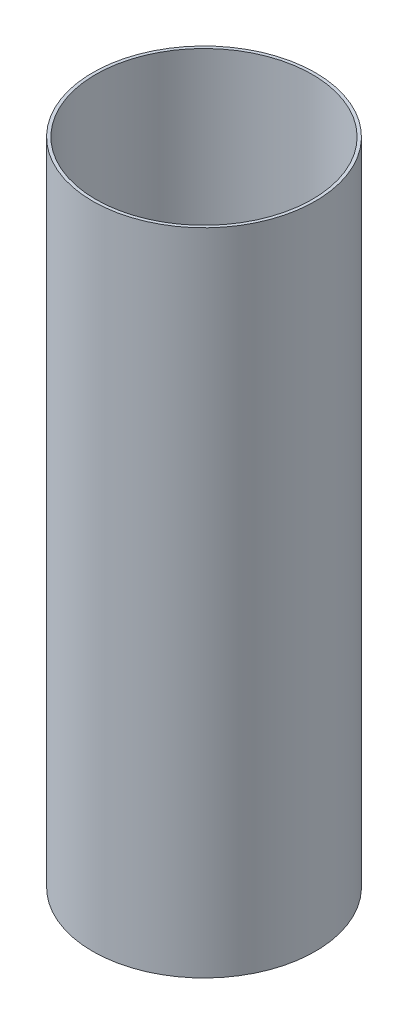
ISO-10303-21;
HEADER;
FILE_DESCRIPTION(('STEP AP214'),'2;1');
FILE_NAME('part.step','',(''),(''),'','','');
FILE_SCHEMA(('AUTOMOTIVE_DESIGN { 1 0 10303 214 1 1 1 1 }'));
ENDSEC;
DATA;
#1=APPLICATION_CONTEXT('core data for automotive mechanical design processes');
#2=APPLICATION_PROTOCOL_DEFINITION('international standard','automotive_design',2000,#1);
#3=PRODUCT_CONTEXT('',#1,'mechanical');
#4=PRODUCT('Part','Part','',(#3));
#5=PRODUCT_RELATED_PRODUCT_CATEGORY('part','',(#4));
#6=PRODUCT_DEFINITION_FORMATION('','',#4);
#7=PRODUCT_DEFINITION_CONTEXT('part definition',#1,'design');
#8=PRODUCT_DEFINITION('design','',#6,#7);
#9=PRODUCT_DEFINITION_SHAPE('','',#8);
#10=(LENGTH_UNIT() NAMED_UNIT(*) SI_UNIT(.MILLI.,.METRE.));
#11=(NAMED_UNIT(*) PLANE_ANGLE_UNIT() SI_UNIT($,.RADIAN.));
#12=(NAMED_UNIT(*) SI_UNIT($,.STERADIAN.) SOLID_ANGLE_UNIT());
#13=UNCERTAINTY_MEASURE_WITH_UNIT(LENGTH_MEASURE(1.E-05),#10,'distance_accuracy_value','');
#14=(GEOMETRIC_REPRESENTATION_CONTEXT(3) GLOBAL_UNCERTAINTY_ASSIGNED_CONTEXT((#13)) GLOBAL_UNIT_ASSIGNED_CONTEXT((#10,
#11,#12)) REPRESENTATION_CONTEXT('',''));
#15=CARTESIAN_POINT('',(0.,0.,0.));
#16=DIRECTION('',(0.,0.,1.));
#17=DIRECTION('',(1.,0.,0.));
#18=AXIS2_PLACEMENT_3D('',#15,#16,#17);
#19=CARTESIAN_POINT('',(0.,457.2,0.));
#20=DIRECTION('',(0.,1.,0.));
#21=DIRECTION('',(0.,0.,1.));
#22=AXIS2_PLACEMENT_3D('',#19,#20,#21);
#23=PLANE('',#22);
#24=CARTESIAN_POINT('',(0.,457.2,0.));
#25=DIRECTION('',(0.,1.,0.));
#26=DIRECTION('',(0.,0.,1.));
#27=AXIS2_PLACEMENT_3D('',#24,#25,#26);
#28=CIRCLE('',#27,78.359);
#29=CARTESIAN_POINT('',(0.,457.2,78.359));
#30=VERTEX_POINT('',#29);
#31=EDGE_CURVE('E10',#30,#30,#28,.T.);
#32=ORIENTED_EDGE('',*,*,#31,.T.);
#33=EDGE_LOOP('',(#32));
#34=FACE_BOUND('',#33,.T.);
#35=CARTESIAN_POINT('',(0.,457.2,0.));
#36=DIRECTION('',(0.,1.,0.));
#37=DIRECTION('',(0.,0.,1.));
#38=AXIS2_PLACEMENT_3D('',#35,#36,#37);
#39=CIRCLE('',#38,76.2);
#40=CARTESIAN_POINT('',(0.,457.2,76.2));
#41=VERTEX_POINT('',#40);
#42=EDGE_CURVE('E42',#41,#41,#39,.T.);
#43=ORIENTED_EDGE('',*,*,#42,.F.);
#44=EDGE_LOOP('',(#43));
#45=FACE_BOUND('',#44,.T.);
#46=ADVANCED_FACE('F31',(#34,#45),#23,.T.);
#47=CARTESIAN_POINT('',(0.,0.,0.));
#48=DIRECTION('',(0.,1.,0.));
#49=DIRECTION('',(0.,0.,1.));
#50=AXIS2_PLACEMENT_3D('',#47,#48,#49);
#51=PLANE('',#50);
#52=CARTESIAN_POINT('',(0.,0.,0.));
#53=DIRECTION('',(0.,1.,0.));
#54=DIRECTION('',(0.,0.,1.));
#55=AXIS2_PLACEMENT_3D('',#52,#53,#54);
#56=CIRCLE('',#55,78.359);
#57=CARTESIAN_POINT('',(0.,0.,78.359));
#58=VERTEX_POINT('',#57);
#59=EDGE_CURVE('E35',#58,#58,#56,.T.);
#60=ORIENTED_EDGE('',*,*,#59,.F.);
#61=EDGE_LOOP('',(#60));
#62=FACE_BOUND('',#61,.T.);
#63=CARTESIAN_POINT('',(0.,0.,0.));
#64=DIRECTION('',(0.,1.,0.));
#65=DIRECTION('',(0.,0.,1.));
#66=AXIS2_PLACEMENT_3D('',#63,#64,#65);
#67=CIRCLE('',#66,76.2);
#68=CARTESIAN_POINT('',(0.,0.,76.2));
#69=VERTEX_POINT('',#68);
#70=EDGE_CURVE('E44',#69,#69,#67,.T.);
#71=ORIENTED_EDGE('',*,*,#70,.T.);
#72=EDGE_LOOP('',(#71));
#73=FACE_BOUND('',#72,.T.);
#74=ADVANCED_FACE('F54',(#62,#73),#51,.F.);
#75=CARTESIAN_POINT('',(0.,457.2,0.));
#76=DIRECTION('',(0.,-1.,0.));
#77=DIRECTION('',(0.,0.,-1.));
#78=AXIS2_PLACEMENT_3D('',#75,#76,#77);
#79=CYLINDRICAL_SURFACE('',#78,78.359);
#80=ORIENTED_EDGE('',*,*,#31,.F.);
#81=EDGE_LOOP('',(#80));
#82=FACE_BOUND('',#81,.T.);
#83=ORIENTED_EDGE('',*,*,#59,.T.);
#84=EDGE_LOOP('',(#83));
#85=FACE_BOUND('',#84,.T.);
#86=ADVANCED_FACE('F33',(#82,#85),#79,.T.);
#87=CARTESIAN_POINT('',(0.,457.2,0.));
#88=DIRECTION('',(0.,-1.,0.));
#89=DIRECTION('',(0.,0.,-1.));
#90=AXIS2_PLACEMENT_3D('',#87,#88,#89);
#91=CYLINDRICAL_SURFACE('',#90,76.2);
#92=ORIENTED_EDGE('',*,*,#42,.T.);
#93=EDGE_LOOP('',(#92));
#94=FACE_BOUND('',#93,.T.);
#95=ORIENTED_EDGE('',*,*,#70,.F.);
#96=EDGE_LOOP('',(#95));
#97=FACE_BOUND('',#96,.T.);
#98=ADVANCED_FACE('F50',(#94,#97),#91,.F.);
#99=CLOSED_SHELL('',(#46,#74,#86,#98));
#100=MANIFOLD_SOLID_BREP('B2',#99);
#101=ADVANCED_BREP_SHAPE_REPRESENTATION('',(#18,#100),#14);
#102=SHAPE_DEFINITION_REPRESENTATION(#9,#101);
ENDSEC;
END-ISO-10303-21;
